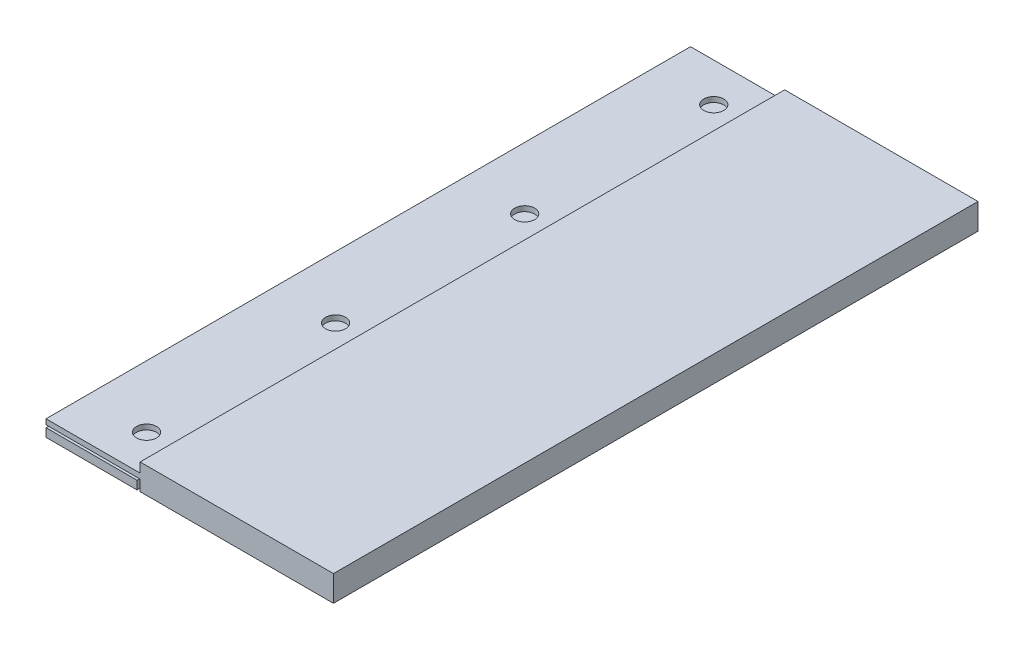
ISO-10303-21;
HEADER;
FILE_DESCRIPTION(('STEP AP214'),'2;1');
FILE_NAME('part.step','',(''),(''),'','','');
FILE_SCHEMA(('AUTOMOTIVE_DESIGN { 1 0 10303 214 1 1 1 1 }'));
ENDSEC;
DATA;
#1=APPLICATION_CONTEXT('core data for automotive mechanical design processes');
#2=APPLICATION_PROTOCOL_DEFINITION('international standard','automotive_design',2000,#1);
#3=PRODUCT_CONTEXT('',#1,'mechanical');
#4=PRODUCT('Part','Part','',(#3));
#5=PRODUCT_RELATED_PRODUCT_CATEGORY('part','',(#4));
#6=PRODUCT_DEFINITION_FORMATION('','',#4);
#7=PRODUCT_DEFINITION_CONTEXT('part definition',#1,'design');
#8=PRODUCT_DEFINITION('design','',#6,#7);
#9=PRODUCT_DEFINITION_SHAPE('','',#8);
#10=(LENGTH_UNIT() NAMED_UNIT(*) SI_UNIT(.MILLI.,.METRE.));
#11=(NAMED_UNIT(*) PLANE_ANGLE_UNIT() SI_UNIT($,.RADIAN.));
#12=(NAMED_UNIT(*) SI_UNIT($,.STERADIAN.) SOLID_ANGLE_UNIT());
#13=UNCERTAINTY_MEASURE_WITH_UNIT(LENGTH_MEASURE(1.E-05),#10,'distance_accuracy_value','');
#14=(GEOMETRIC_REPRESENTATION_CONTEXT(3) GLOBAL_UNCERTAINTY_ASSIGNED_CONTEXT((#13)) GLOBAL_UNIT_ASSIGNED_CONTEXT((#10,
#11,#12)) REPRESENTATION_CONTEXT('',''));
#15=CARTESIAN_POINT('',(0.,0.,0.));
#16=DIRECTION('',(0.,0.,1.));
#17=DIRECTION('',(1.,0.,0.));
#18=AXIS2_PLACEMENT_3D('',#15,#16,#17);
#19=CARTESIAN_POINT('',(-14.6,1.3,-14.6013697987552));
#20=DIRECTION('',(0.,1.,0.));
#21=DIRECTION('',(-1.,0.,0.));
#22=AXIS2_PLACEMENT_3D('',#19,#20,#21);
#23=PLANE('',#22);
#24=DIRECTION('',(1.,0.,0.));
#25=VECTOR('',#24,1.);
#26=CARTESIAN_POINT('',(-9.59600159872123,1.3,0.));
#27=LINE('',#26,#25);
#28=CARTESIAN_POINT('',(-14.6,1.29999999999999,0.));
#29=VERTEX_POINT('',#28);
#30=CARTESIAN_POINT('',(-0.48,1.3,0.));
#31=VERTEX_POINT('',#30);
#32=EDGE_CURVE('E64',#29,#31,#27,.T.);
#33=ORIENTED_EDGE('',*,*,#32,.F.);
#34=DIRECTION('',(0.,0.,-1.));
#35=VECTOR('',#34,1.);
#36=CARTESIAN_POINT('',(-14.6,1.3,0.));
#37=LINE('',#36,#35);
#38=CARTESIAN_POINT('',(-14.6,1.3,100.));
#39=VERTEX_POINT('',#38);
#40=EDGE_CURVE('E109',#39,#29,#37,.T.);
#41=ORIENTED_EDGE('',*,*,#40,.F.);
#42=DIRECTION('',(-1.,0.,0.));
#43=VECTOR('',#42,1.);
#44=CARTESIAN_POINT('',(-0.479999999999962,1.3,100.));
#45=LINE('',#44,#43);
#46=CARTESIAN_POINT('',(-0.479999999999988,1.30000000000002,100.));
#47=VERTEX_POINT('',#46);
#48=EDGE_CURVE('E105',#47,#39,#45,.T.);
#49=ORIENTED_EDGE('',*,*,#48,.F.);
#50=DIRECTION('',(0.,0.,1.));
#51=VECTOR('',#50,1.);
#52=CARTESIAN_POINT('',(-0.479999999999988,1.3,100.));
#53=LINE('',#52,#51);
#54=EDGE_CURVE('E100',#31,#47,#53,.T.);
#55=ORIENTED_EDGE('',*,*,#54,.F.);
#56=EDGE_LOOP('',(#33,#41,#49,#55));
#57=FACE_BOUND('',#56,.T.);
#58=ADVANCED_FACE('F56',(#57),#23,.T.);
#59=CARTESIAN_POINT('',(0.,0.,0.));
#60=DIRECTION('',(0.,1.,0.));
#61=DIRECTION('',(0.,0.,1.));
#62=AXIS2_PLACEMENT_3D('',#59,#60,#61);
#63=PLANE('',#62);
#64=DIRECTION('',(1.,0.,0.));
#65=VECTOR('',#64,1.);
#66=CARTESIAN_POINT('',(-9.59600159872126,0.,0.));
#67=LINE('',#66,#65);
#68=CARTESIAN_POINT('',(-14.6,0.,0.));
#69=VERTEX_POINT('',#68);
#70=CARTESIAN_POINT('',(-0.48,0.,0.));
#71=VERTEX_POINT('',#70);
#72=EDGE_CURVE('E118',#69,#71,#67,.T.);
#73=ORIENTED_EDGE('',*,*,#72,.T.);
#74=DIRECTION('',(0.,0.,1.));
#75=VECTOR('',#74,1.);
#76=CARTESIAN_POINT('',(-0.479999999999988,0.,100.));
#77=LINE('',#76,#75);
#78=CARTESIAN_POINT('',(-0.479999999999988,0.,100.));
#79=VERTEX_POINT('',#78);
#80=EDGE_CURVE('E97',#71,#79,#77,.T.);
#81=ORIENTED_EDGE('',*,*,#80,.T.);
#82=DIRECTION('',(-1.,0.,0.));
#83=VECTOR('',#82,1.);
#84=CARTESIAN_POINT('',(-0.479999999999988,0.,100.));
#85=LINE('',#84,#83);
#86=CARTESIAN_POINT('',(-14.6,0.,100.));
#87=VERTEX_POINT('',#86);
#88=EDGE_CURVE('E91',#79,#87,#85,.T.);
#89=ORIENTED_EDGE('',*,*,#88,.T.);
#90=DIRECTION('',(0.,0.,-1.));
#91=VECTOR('',#90,1.);
#92=CARTESIAN_POINT('',(-14.6,0.,0.));
#93=LINE('',#92,#91);
#94=EDGE_CURVE('E96',#87,#69,#93,.T.);
#95=ORIENTED_EDGE('',*,*,#94,.T.);
#96=EDGE_LOOP('',(#73,#81,#89,#95));
#97=FACE_BOUND('',#96,.T.);
#98=ADVANCED_FACE('F94',(#97),#63,.F.);
#99=CARTESIAN_POINT('',(-0.479999999999988,102.114647761907,100.));
#100=DIRECTION('',(1.,0.,0.));
#101=DIRECTION('',(0.,0.,-1.));
#102=AXIS2_PLACEMENT_3D('',#99,#100,#101);
#103=PLANE('',#102);
#104=DIRECTION('',(0.,-1.,0.));
#105=VECTOR('',#104,1.);
#106=CARTESIAN_POINT('',(-0.48,102.114647761907,0.));
#107=LINE('',#106,#105);
#108=EDGE_CURVE('E13',#31,#71,#107,.T.);
#109=ORIENTED_EDGE('',*,*,#108,.F.);
#110=ORIENTED_EDGE('',*,*,#54,.T.);
#111=DIRECTION('',(0.,-1.,0.));
#112=VECTOR('',#111,1.);
#113=CARTESIAN_POINT('',(-0.479999999999988,102.114647761907,100.));
#114=LINE('',#113,#112);
#115=EDGE_CURVE('E124',#47,#79,#114,.T.);
#116=ORIENTED_EDGE('',*,*,#115,.T.);
#117=ORIENTED_EDGE('',*,*,#80,.F.);
#118=EDGE_LOOP('',(#109,#110,#116,#117));
#119=FACE_BOUND('',#118,.T.);
#120=ADVANCED_FACE('F127',(#119),#103,.T.);
#121=CARTESIAN_POINT('',(-0.479999999999988,102.114647761907,100.));
#122=DIRECTION('',(0.,0.,1.));
#123=DIRECTION('',(1.,0.,0.));
#124=AXIS2_PLACEMENT_3D('',#121,#122,#123);
#125=PLANE('',#124);
#126=ORIENTED_EDGE('',*,*,#115,.F.);
#127=ORIENTED_EDGE('',*,*,#48,.T.);
#128=DIRECTION('',(0.,-1.,0.));
#129=VECTOR('',#128,1.);
#130=CARTESIAN_POINT('',(-14.6,101.825121722772,100.));
#131=LINE('',#130,#129);
#132=EDGE_CURVE('E103',#39,#87,#131,.T.);
#133=ORIENTED_EDGE('',*,*,#132,.T.);
#134=ORIENTED_EDGE('',*,*,#88,.F.);
#135=EDGE_LOOP('',(#126,#127,#133,#134));
#136=FACE_BOUND('',#135,.T.);
#137=ADVANCED_FACE('F104',(#136),#125,.T.);
#138=CARTESIAN_POINT('',(-9.59600159872126,102.114647761907,0.));
#139=DIRECTION('',(0.,0.,-1.));
#140=DIRECTION('',(-1.,0.,0.));
#141=AXIS2_PLACEMENT_3D('',#138,#139,#140);
#142=PLANE('',#141);
#143=ORIENTED_EDGE('',*,*,#72,.F.);
#144=DIRECTION('',(0.,-1.,0.));
#145=VECTOR('',#144,1.);
#146=CARTESIAN_POINT('',(-14.6,101.825121722772,0.));
#147=LINE('',#146,#145);
#148=EDGE_CURVE('E114',#29,#69,#147,.T.);
#149=ORIENTED_EDGE('',*,*,#148,.F.);
#150=ORIENTED_EDGE('',*,*,#32,.T.);
#151=ORIENTED_EDGE('',*,*,#108,.T.);
#152=EDGE_LOOP('',(#143,#149,#150,#151));
#153=FACE_BOUND('',#152,.T.);
#154=ADVANCED_FACE('F130',(#153),#142,.T.);
#155=CARTESIAN_POINT('',(-14.6,101.825121722772,0.));
#156=DIRECTION('',(-1.,0.,0.));
#157=DIRECTION('',(0.,0.,1.));
#158=AXIS2_PLACEMENT_3D('',#155,#156,#157);
#159=PLANE('',#158);
#160=ORIENTED_EDGE('',*,*,#132,.F.);
#161=ORIENTED_EDGE('',*,*,#40,.T.);
#162=ORIENTED_EDGE('',*,*,#148,.T.);
#163=ORIENTED_EDGE('',*,*,#94,.F.);
#164=EDGE_LOOP('',(#160,#161,#162,#163));
#165=FACE_BOUND('',#164,.T.);
#166=ADVANCED_FACE('F112',(#165),#159,.T.);
#167=CLOSED_SHELL('',(#58,#98,#120,#137,#154,#166));
#168=MANIFOLD_SOLID_BREP('B2',#167);
#169=CARTESIAN_POINT('',(0.,4.,0.));
#170=DIRECTION('',(1.,0.,0.));
#171=DIRECTION('',(0.,0.,1.));
#172=AXIS2_PLACEMENT_3D('',#169,#170,#171);
#173=PLANE('',#172);
#174=DIRECTION('',(0.,-1.,0.));
#175=VECTOR('',#174,1.);
#176=CARTESIAN_POINT('',(0.,4.,100.));
#177=LINE('',#176,#175);
#178=CARTESIAN_POINT('',(0.,1.7,100.));
#179=VERTEX_POINT('',#178);
#180=CARTESIAN_POINT('',(0.,0.,100.));
#181=VERTEX_POINT('',#180);
#182=EDGE_CURVE('E264',#179,#181,#177,.T.);
#183=ORIENTED_EDGE('',*,*,#182,.F.);
#184=DIRECTION('',(0.,0.,1.));
#185=VECTOR('',#184,1.);
#186=CARTESIAN_POINT('',(0.,1.7,-14.6013697987552));
#187=LINE('',#186,#185);
#188=CARTESIAN_POINT('',(0.,1.7,0.));
#189=VERTEX_POINT('',#188);
#190=EDGE_CURVE('E266',#189,#179,#187,.T.);
#191=ORIENTED_EDGE('',*,*,#190,.F.);
#192=DIRECTION('',(0.,-1.,0.));
#193=VECTOR('',#192,1.);
#194=CARTESIAN_POINT('',(0.,4.,0.));
#195=LINE('',#194,#193);
#196=CARTESIAN_POINT('',(0.,0.,0.));
#197=VERTEX_POINT('',#196);
#198=EDGE_CURVE('E208',#189,#197,#195,.T.);
#199=ORIENTED_EDGE('',*,*,#198,.T.);
#200=DIRECTION('',(0.,0.,-1.));
#201=VECTOR('',#200,1.);
#202=CARTESIAN_POINT('',(0.,0.,0.));
#203=LINE('',#202,#201);
#204=EDGE_CURVE('E268',#181,#197,#203,.T.);
#205=ORIENTED_EDGE('',*,*,#204,.F.);
#206=EDGE_LOOP('',(#183,#191,#199,#205));
#207=FACE_BOUND('',#206,.T.);
#208=ADVANCED_FACE('F199',(#207),#173,.F.);
#209=CARTESIAN_POINT('',(0.,4.,0.));
#210=VERTEX_POINT('',#209);
#211=CARTESIAN_POINT('',(0.,2.5,0.));
#212=VERTEX_POINT('',#211);
#213=EDGE_CURVE('E54',#210,#212,#195,.T.);
#214=ORIENTED_EDGE('',*,*,#213,.T.);
#215=DIRECTION('',(0.,0.,1.));
#216=VECTOR('',#215,1.);
#217=CARTESIAN_POINT('',(0.,2.5,-14.6342065039414));
#218=LINE('',#217,#216);
#219=CARTESIAN_POINT('',(0.,2.5,100.));
#220=VERTEX_POINT('',#219);
#221=EDGE_CURVE('E218',#212,#220,#218,.T.);
#222=ORIENTED_EDGE('',*,*,#221,.T.);
#223=CARTESIAN_POINT('',(0.,4.,100.));
#224=VERTEX_POINT('',#223);
#225=EDGE_CURVE('E272',#224,#220,#177,.T.);
#226=ORIENTED_EDGE('',*,*,#225,.F.);
#227=DIRECTION('',(0.,0.,-1.));
#228=VECTOR('',#227,1.);
#229=CARTESIAN_POINT('',(0.,4.,0.));
#230=LINE('',#229,#228);
#231=EDGE_CURVE('E325',#224,#210,#230,.T.);
#232=ORIENTED_EDGE('',*,*,#231,.T.);
#233=EDGE_LOOP('',(#214,#222,#226,#232));
#234=FACE_BOUND('',#233,.T.);
#235=ADVANCED_FACE('F201',(#234),#173,.F.);
#236=CARTESIAN_POINT('',(0.,4.,0.));
#237=DIRECTION('',(0.,0.,1.));
#238=DIRECTION('',(-1.,0.,0.));
#239=AXIS2_PLACEMENT_3D('',#236,#237,#238);
#240=PLANE('',#239);
#241=ORIENTED_EDGE('',*,*,#198,.F.);
#242=DIRECTION('',(1.,0.,0.));
#243=VECTOR('',#242,1.);
#244=CARTESIAN_POINT('',(-14.6,1.7,0.));
#245=LINE('',#244,#243);
#246=CARTESIAN_POINT('',(-14.6,1.7,0.));
#247=VERTEX_POINT('',#246);
#248=EDGE_CURVE('E282',#247,#189,#245,.T.);
#249=ORIENTED_EDGE('',*,*,#248,.F.);
#250=DIRECTION('',(0.,1.,0.));
#251=VECTOR('',#250,1.);
#252=CARTESIAN_POINT('',(-14.6,2.5,0.));
#253=LINE('',#252,#251);
#254=CARTESIAN_POINT('',(-14.6,2.5,0.));
#255=VERTEX_POINT('',#254);
#256=EDGE_CURVE('E317',#247,#255,#253,.T.);
#257=ORIENTED_EDGE('',*,*,#256,.T.);
#258=DIRECTION('',(1.,0.,0.));
#259=VECTOR('',#258,1.);
#260=CARTESIAN_POINT('',(0.,2.5,0.));
#261=LINE('',#260,#259);
#262=EDGE_CURVE('E315',#255,#212,#261,.T.);
#263=ORIENTED_EDGE('',*,*,#262,.T.);
#264=ORIENTED_EDGE('',*,*,#213,.F.);
#265=DIRECTION('',(1.,0.,0.));
#266=VECTOR('',#265,1.);
#267=CARTESIAN_POINT('',(0.,4.,0.));
#268=LINE('',#267,#266);
#269=CARTESIAN_POINT('',(30.,4.,0.));
#270=VERTEX_POINT('',#269);
#271=EDGE_CURVE('E327',#210,#270,#268,.T.);
#272=ORIENTED_EDGE('',*,*,#271,.T.);
#273=DIRECTION('',(0.,-1.,0.));
#274=VECTOR('',#273,1.);
#275=CARTESIAN_POINT('',(30.,4.,0.));
#276=LINE('',#275,#274);
#277=CARTESIAN_POINT('',(30.,0.,0.));
#278=VERTEX_POINT('',#277);
#279=EDGE_CURVE('E346',#270,#278,#276,.T.);
#280=ORIENTED_EDGE('',*,*,#279,.T.);
#281=DIRECTION('',(1.,0.,0.));
#282=VECTOR('',#281,1.);
#283=CARTESIAN_POINT('',(0.,0.,0.));
#284=LINE('',#283,#282);
#285=EDGE_CURVE('E336',#197,#278,#284,.T.);
#286=ORIENTED_EDGE('',*,*,#285,.F.);
#287=EDGE_LOOP('',(#241,#249,#257,#263,#264,#272,#280,#286));
#288=FACE_BOUND('',#287,.T.);
#289=ADVANCED_FACE('F351',(#288),#240,.F.);
#290=CARTESIAN_POINT('',(30.,4.,0.));
#291=DIRECTION('',(-1.,0.,0.));
#292=DIRECTION('',(0.,0.,-1.));
#293=AXIS2_PLACEMENT_3D('',#290,#291,#292);
#294=PLANE('',#293);
#295=DIRECTION('',(0.,0.,1.));
#296=VECTOR('',#295,1.);
#297=CARTESIAN_POINT('',(30.,0.,0.));
#298=LINE('',#297,#296);
#299=CARTESIAN_POINT('',(30.,0.,100.));
#300=VERTEX_POINT('',#299);
#301=EDGE_CURVE('E339',#278,#300,#298,.T.);
#302=ORIENTED_EDGE('',*,*,#301,.F.);
#303=ORIENTED_EDGE('',*,*,#279,.F.);
#304=DIRECTION('',(0.,0.,1.));
#305=VECTOR('',#304,1.);
#306=CARTESIAN_POINT('',(30.,4.,0.));
#307=LINE('',#306,#305);
#308=CARTESIAN_POINT('',(30.,4.,100.));
#309=VERTEX_POINT('',#308);
#310=EDGE_CURVE('E331',#270,#309,#307,.T.);
#311=ORIENTED_EDGE('',*,*,#310,.T.);
#312=DIRECTION('',(0.,-1.,0.));
#313=VECTOR('',#312,1.);
#314=CARTESIAN_POINT('',(30.,4.,100.));
#315=LINE('',#314,#313);
#316=EDGE_CURVE('E343',#309,#300,#315,.T.);
#317=ORIENTED_EDGE('',*,*,#316,.T.);
#318=EDGE_LOOP('',(#302,#303,#311,#317));
#319=FACE_BOUND('',#318,.T.);
#320=ADVANCED_FACE('F356',(#319),#294,.F.);
#321=CARTESIAN_POINT('',(0.,4.,100.));
#322=DIRECTION('',(0.,0.,-1.));
#323=DIRECTION('',(1.,0.,0.));
#324=AXIS2_PLACEMENT_3D('',#321,#322,#323);
#325=PLANE('',#324);
#326=DIRECTION('',(-1.,0.,0.));
#327=VECTOR('',#326,1.);
#328=CARTESIAN_POINT('',(-14.6,1.7,100.));
#329=LINE('',#328,#327);
#330=CARTESIAN_POINT('',(-14.6,1.7,100.));
#331=VERTEX_POINT('',#330);
#332=EDGE_CURVE('E279',#179,#331,#329,.T.);
#333=ORIENTED_EDGE('',*,*,#332,.F.);
#334=ORIENTED_EDGE('',*,*,#182,.T.);
#335=DIRECTION('',(-1.,0.,0.));
#336=VECTOR('',#335,1.);
#337=CARTESIAN_POINT('',(0.,0.,100.));
#338=LINE('',#337,#336);
#339=EDGE_CURVE('E328',#300,#181,#338,.T.);
#340=ORIENTED_EDGE('',*,*,#339,.F.);
#341=ORIENTED_EDGE('',*,*,#316,.F.);
#342=DIRECTION('',(-1.,0.,0.));
#343=VECTOR('',#342,1.);
#344=CARTESIAN_POINT('',(0.,4.,100.));
#345=LINE('',#344,#343);
#346=EDGE_CURVE('E273',#309,#224,#345,.T.);
#347=ORIENTED_EDGE('',*,*,#346,.T.);
#348=ORIENTED_EDGE('',*,*,#225,.T.);
#349=DIRECTION('',(-1.,0.,0.));
#350=VECTOR('',#349,1.);
#351=CARTESIAN_POINT('',(0.,2.5,100.));
#352=LINE('',#351,#350);
#353=CARTESIAN_POINT('',(-14.6,2.5,100.));
#354=VERTEX_POINT('',#353);
#355=EDGE_CURVE('E321',#220,#354,#352,.T.);
#356=ORIENTED_EDGE('',*,*,#355,.T.);
#357=DIRECTION('',(0.,-1.,0.));
#358=VECTOR('',#357,1.);
#359=CARTESIAN_POINT('',(-14.6,2.5,100.));
#360=LINE('',#359,#358);
#361=EDGE_CURVE('E289',#354,#331,#360,.T.);
#362=ORIENTED_EDGE('',*,*,#361,.T.);
#363=EDGE_LOOP('',(#333,#334,#340,#341,#347,#348,#356,#362));
#364=FACE_BOUND('',#363,.T.);
#365=ADVANCED_FACE('F286',(#364),#325,.F.);
#366=CARTESIAN_POINT('',(0.,4.,0.));
#367=DIRECTION('',(0.,-1.,0.));
#368=DIRECTION('',(0.,0.,-1.));
#369=AXIS2_PLACEMENT_3D('',#366,#367,#368);
#370=PLANE('',#369);
#371=ORIENTED_EDGE('',*,*,#231,.F.);
#372=ORIENTED_EDGE('',*,*,#346,.F.);
#373=ORIENTED_EDGE('',*,*,#310,.F.);
#374=ORIENTED_EDGE('',*,*,#271,.F.);
#375=EDGE_LOOP('',(#371,#372,#373,#374));
#376=FACE_BOUND('',#375,.T.);
#377=ADVANCED_FACE('F359',(#376),#370,.F.);
#378=CARTESIAN_POINT('',(0.,0.,0.));
#379=DIRECTION('',(0.,-1.,0.));
#380=DIRECTION('',(0.,0.,-1.));
#381=AXIS2_PLACEMENT_3D('',#378,#379,#380);
#382=PLANE('',#381);
#383=ORIENTED_EDGE('',*,*,#204,.T.);
#384=ORIENTED_EDGE('',*,*,#285,.T.);
#385=ORIENTED_EDGE('',*,*,#301,.T.);
#386=ORIENTED_EDGE('',*,*,#339,.T.);
#387=EDGE_LOOP('',(#383,#384,#385,#386));
#388=FACE_BOUND('',#387,.T.);
#389=ADVANCED_FACE('F353',(#388),#382,.T.);
#390=CARTESIAN_POINT('',(-14.6,2.5,-14.6342065039414));
#391=DIRECTION('',(-1.,0.,0.));
#392=DIRECTION('',(0.,0.,1.));
#393=AXIS2_PLACEMENT_3D('',#390,#391,#392);
#394=PLANE('',#393);
#395=DIRECTION('',(0.,0.,1.));
#396=VECTOR('',#395,1.);
#397=CARTESIAN_POINT('',(-14.6,1.7,-14.6013697987552));
#398=LINE('',#397,#396);
#399=EDGE_CURVE('E283',#247,#331,#398,.T.);
#400=ORIENTED_EDGE('',*,*,#399,.T.);
#401=ORIENTED_EDGE('',*,*,#361,.F.);
#402=DIRECTION('',(0.,0.,1.));
#403=VECTOR('',#402,1.);
#404=CARTESIAN_POINT('',(-14.6,2.5,-14.6342065039414));
#405=LINE('',#404,#403);
#406=EDGE_CURVE('E318',#255,#354,#405,.T.);
#407=ORIENTED_EDGE('',*,*,#406,.F.);
#408=ORIENTED_EDGE('',*,*,#256,.F.);
#409=EDGE_LOOP('',(#400,#401,#407,#408));
#410=FACE_BOUND('',#409,.T.);
#411=ADVANCED_FACE('F367',(#410),#394,.T.);
#412=CARTESIAN_POINT('',(0.,2.5,-14.6342065039414));
#413=DIRECTION('',(0.,1.,0.));
#414=DIRECTION('',(-1.,0.,0.));
#415=AXIS2_PLACEMENT_3D('',#412,#413,#414);
#416=PLANE('',#415);
#417=CARTESIAN_POINT('',(-5.,2.5,6.));
#418=DIRECTION('',(0.,1.,0.));
#419=DIRECTION('',(-1.,0.,0.));
#420=AXIS2_PLACEMENT_3D('',#417,#418,#419);
#421=CIRCLE('',#420,1.55);
#422=CARTESIAN_POINT('',(-6.55,2.5,6.));
#423=VERTEX_POINT('',#422);
#424=EDGE_CURVE('E312',#423,#423,#421,.T.);
#425=ORIENTED_EDGE('',*,*,#424,.F.);
#426=EDGE_LOOP('',(#425));
#427=FACE_BOUND('',#426,.T.);
#428=CARTESIAN_POINT('',(-5.,2.5,35.3333333333333));
#429=DIRECTION('',(0.,1.,0.));
#430=DIRECTION('',(-1.,0.,0.));
#431=AXIS2_PLACEMENT_3D('',#428,#429,#430);
#432=CIRCLE('',#431,1.55);
#433=CARTESIAN_POINT('',(-6.55,2.5,35.3333333333333));
#434=VERTEX_POINT('',#433);
#435=EDGE_CURVE('E309',#434,#434,#432,.T.);
#436=ORIENTED_EDGE('',*,*,#435,.F.);
#437=EDGE_LOOP('',(#436));
#438=FACE_BOUND('',#437,.T.);
#439=CARTESIAN_POINT('',(-5.,2.5,94.));
#440=DIRECTION('',(0.,1.,0.));
#441=DIRECTION('',(-1.,0.,0.));
#442=AXIS2_PLACEMENT_3D('',#439,#440,#441);
#443=CIRCLE('',#442,1.55);
#444=CARTESIAN_POINT('',(-6.55,2.5,94.));
#445=VERTEX_POINT('',#444);
#446=EDGE_CURVE('E306',#445,#445,#443,.T.);
#447=ORIENTED_EDGE('',*,*,#446,.F.);
#448=EDGE_LOOP('',(#447));
#449=FACE_BOUND('',#448,.T.);
#450=CARTESIAN_POINT('',(-5.,2.5,64.6666666666667));
#451=DIRECTION('',(0.,1.,0.));
#452=DIRECTION('',(-1.,0.,0.));
#453=AXIS2_PLACEMENT_3D('',#450,#451,#452);
#454=CIRCLE('',#453,1.55);
#455=CARTESIAN_POINT('',(-6.55,2.5,64.6666666666667));
#456=VERTEX_POINT('',#455);
#457=EDGE_CURVE('E303',#456,#456,#454,.T.);
#458=ORIENTED_EDGE('',*,*,#457,.F.);
#459=EDGE_LOOP('',(#458));
#460=FACE_BOUND('',#459,.T.);
#461=ORIENTED_EDGE('',*,*,#262,.F.);
#462=ORIENTED_EDGE('',*,*,#406,.T.);
#463=ORIENTED_EDGE('',*,*,#355,.F.);
#464=ORIENTED_EDGE('',*,*,#221,.F.);
#465=EDGE_LOOP('',(#461,#462,#463,#464));
#466=FACE_BOUND('',#465,.T.);
#467=ADVANCED_FACE('F363',(#427,#438,#449,#460,#466),#416,.T.);
#468=CARTESIAN_POINT('',(-5.,0.,64.6666666666667));
#469=DIRECTION('',(0.,1.,0.));
#470=DIRECTION('',(0.,0.,1.));
#471=AXIS2_PLACEMENT_3D('',#468,#469,#470);
#472=CYLINDRICAL_SURFACE('',#471,1.55);
#473=CARTESIAN_POINT('',(-5.,1.7,64.6666666666667));
#474=DIRECTION('',(0.,1.,0.));
#475=DIRECTION('',(-1.,0.,0.));
#476=AXIS2_PLACEMENT_3D('',#473,#474,#475);
#477=CIRCLE('',#476,1.55);
#478=CARTESIAN_POINT('',(-6.55,1.7,64.6666666666667));
#479=VERTEX_POINT('',#478);
#480=EDGE_CURVE('E300',#479,#479,#477,.F.);
#481=ORIENTED_EDGE('',*,*,#480,.T.);
#482=EDGE_LOOP('',(#481));
#483=FACE_BOUND('',#482,.T.);
#484=ORIENTED_EDGE('',*,*,#457,.T.);
#485=EDGE_LOOP('',(#484));
#486=FACE_BOUND('',#485,.T.);
#487=ADVANCED_FACE('F418',(#483,#486),#472,.F.);
#488=CARTESIAN_POINT('',(-5.,0.,94.));
#489=DIRECTION('',(0.,1.,0.));
#490=DIRECTION('',(0.,0.,1.));
#491=AXIS2_PLACEMENT_3D('',#488,#489,#490);
#492=CYLINDRICAL_SURFACE('',#491,1.55);
#493=CARTESIAN_POINT('',(-5.,1.7,94.));
#494=DIRECTION('',(0.,1.,0.));
#495=DIRECTION('',(-1.,0.,0.));
#496=AXIS2_PLACEMENT_3D('',#493,#494,#495);
#497=CIRCLE('',#496,1.55);
#498=CARTESIAN_POINT('',(-6.55,1.7,94.));
#499=VERTEX_POINT('',#498);
#500=EDGE_CURVE('E297',#499,#499,#497,.F.);
#501=ORIENTED_EDGE('',*,*,#500,.T.);
#502=EDGE_LOOP('',(#501));
#503=FACE_BOUND('',#502,.T.);
#504=ORIENTED_EDGE('',*,*,#446,.T.);
#505=EDGE_LOOP('',(#504));
#506=FACE_BOUND('',#505,.T.);
#507=ADVANCED_FACE('F423',(#503,#506),#492,.F.);
#508=CARTESIAN_POINT('',(-5.,0.,35.3333333333333));
#509=DIRECTION('',(0.,1.,0.));
#510=DIRECTION('',(0.,0.,1.));
#511=AXIS2_PLACEMENT_3D('',#508,#509,#510);
#512=CYLINDRICAL_SURFACE('',#511,1.55);
#513=CARTESIAN_POINT('',(-5.,1.7,35.3333333333333));
#514=DIRECTION('',(0.,1.,0.));
#515=DIRECTION('',(-1.,0.,0.));
#516=AXIS2_PLACEMENT_3D('',#513,#514,#515);
#517=CIRCLE('',#516,1.55);
#518=CARTESIAN_POINT('',(-6.55,1.7,35.3333333333333));
#519=VERTEX_POINT('',#518);
#520=EDGE_CURVE('E294',#519,#519,#517,.F.);
#521=ORIENTED_EDGE('',*,*,#520,.T.);
#522=EDGE_LOOP('',(#521));
#523=FACE_BOUND('',#522,.T.);
#524=ORIENTED_EDGE('',*,*,#435,.T.);
#525=EDGE_LOOP('',(#524));
#526=FACE_BOUND('',#525,.T.);
#527=ADVANCED_FACE('F433',(#523,#526),#512,.F.);
#528=CARTESIAN_POINT('',(-5.,0.,6.));
#529=DIRECTION('',(0.,1.,0.));
#530=DIRECTION('',(0.,0.,1.));
#531=AXIS2_PLACEMENT_3D('',#528,#529,#530);
#532=CYLINDRICAL_SURFACE('',#531,1.55);
#533=CARTESIAN_POINT('',(-5.,1.7,6.));
#534=DIRECTION('',(0.,1.,0.));
#535=DIRECTION('',(-1.,0.,0.));
#536=AXIS2_PLACEMENT_3D('',#533,#534,#535);
#537=CIRCLE('',#536,1.55);
#538=CARTESIAN_POINT('',(-6.55,1.7,6.));
#539=VERTEX_POINT('',#538);
#540=EDGE_CURVE('E203',#539,#539,#537,.F.);
#541=ORIENTED_EDGE('',*,*,#540,.T.);
#542=EDGE_LOOP('',(#541));
#543=FACE_BOUND('',#542,.T.);
#544=ORIENTED_EDGE('',*,*,#424,.T.);
#545=EDGE_LOOP('',(#544));
#546=FACE_BOUND('',#545,.T.);
#547=ADVANCED_FACE('F443',(#543,#546),#532,.F.);
#548=CARTESIAN_POINT('',(-14.6,1.7,-14.6013697987552));
#549=DIRECTION('',(0.,1.,0.));
#550=DIRECTION('',(-1.,0.,0.));
#551=AXIS2_PLACEMENT_3D('',#548,#549,#550);
#552=PLANE('',#551);
#553=ORIENTED_EDGE('',*,*,#500,.F.);
#554=EDGE_LOOP('',(#553));
#555=FACE_BOUND('',#554,.T.);
#556=ORIENTED_EDGE('',*,*,#540,.F.);
#557=EDGE_LOOP('',(#556));
#558=FACE_BOUND('',#557,.T.);
#559=ORIENTED_EDGE('',*,*,#248,.T.);
#560=ORIENTED_EDGE('',*,*,#190,.T.);
#561=ORIENTED_EDGE('',*,*,#332,.T.);
#562=ORIENTED_EDGE('',*,*,#399,.F.);
#563=EDGE_LOOP('',(#559,#560,#561,#562));
#564=FACE_BOUND('',#563,.T.);
#565=ORIENTED_EDGE('',*,*,#520,.F.);
#566=EDGE_LOOP('',(#565));
#567=FACE_BOUND('',#566,.T.);
#568=ORIENTED_EDGE('',*,*,#480,.F.);
#569=EDGE_LOOP('',(#568));
#570=FACE_BOUND('',#569,.T.);
#571=ADVANCED_FACE('F277',(#555,#558,#564,#567,#570),#552,.F.);
#572=CLOSED_SHELL('',(#208,#235,#289,#320,#365,#377,#389,#411,#467,#487,#507,#527,#547,#571));
#573=MANIFOLD_SOLID_BREP('B7',#572);
#574=ADVANCED_BREP_SHAPE_REPRESENTATION('',(#18,#168,#573),#14);
#575=SHAPE_DEFINITION_REPRESENTATION(#9,#574);
ENDSEC;
END-ISO-10303-21;
